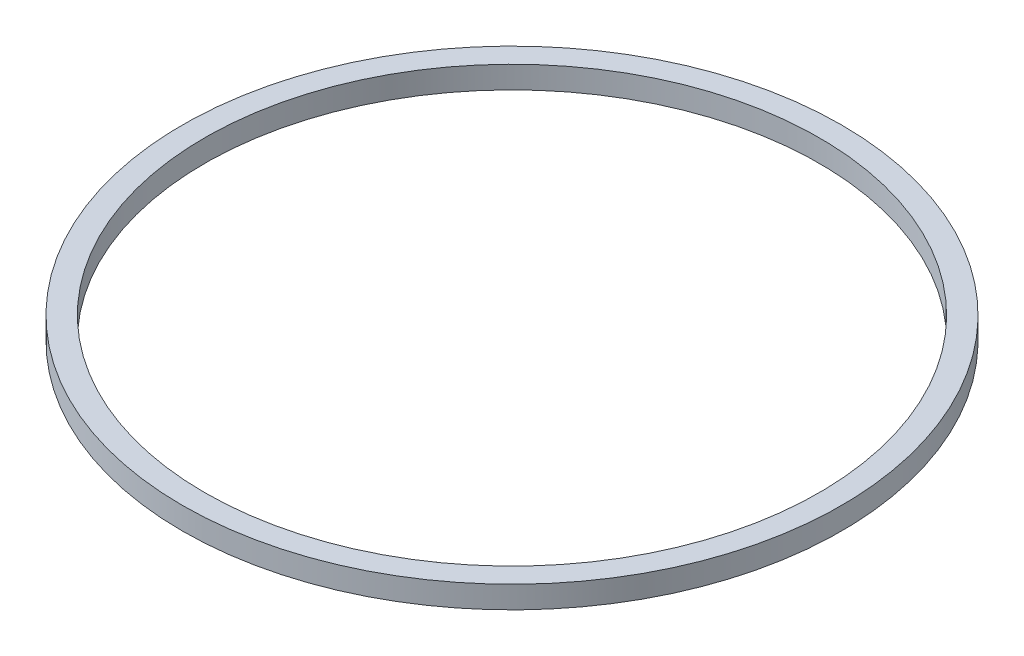
ISO-10303-21;
HEADER;
FILE_DESCRIPTION(('STEP AP214'),'2;1');
FILE_NAME('part.step','',(''),(''),'','','');
FILE_SCHEMA(('AUTOMOTIVE_DESIGN { 1 0 10303 214 1 1 1 1 }'));
ENDSEC;
DATA;
#1=APPLICATION_CONTEXT('core data for automotive mechanical design processes');
#2=APPLICATION_PROTOCOL_DEFINITION('international standard','automotive_design',2000,#1);
#3=PRODUCT_CONTEXT('',#1,'mechanical');
#4=PRODUCT('Part','Part','',(#3));
#5=PRODUCT_RELATED_PRODUCT_CATEGORY('part','',(#4));
#6=PRODUCT_DEFINITION_FORMATION('','',#4);
#7=PRODUCT_DEFINITION_CONTEXT('part definition',#1,'design');
#8=PRODUCT_DEFINITION('design','',#6,#7);
#9=PRODUCT_DEFINITION_SHAPE('','',#8);
#10=(LENGTH_UNIT() NAMED_UNIT(*) SI_UNIT(.MILLI.,.METRE.));
#11=(NAMED_UNIT(*) PLANE_ANGLE_UNIT() SI_UNIT($,.RADIAN.));
#12=(NAMED_UNIT(*) SI_UNIT($,.STERADIAN.) SOLID_ANGLE_UNIT());
#13=UNCERTAINTY_MEASURE_WITH_UNIT(LENGTH_MEASURE(1.E-05),#10,'distance_accuracy_value','');
#14=(GEOMETRIC_REPRESENTATION_CONTEXT(3) GLOBAL_UNCERTAINTY_ASSIGNED_CONTEXT((#13)) GLOBAL_UNIT_ASSIGNED_CONTEXT((#10,
#11,#12)) REPRESENTATION_CONTEXT('',''));
#15=CARTESIAN_POINT('',(0.,0.,0.));
#16=DIRECTION('',(0.,0.,1.));
#17=DIRECTION('',(1.,0.,0.));
#18=AXIS2_PLACEMENT_3D('',#15,#16,#17);
#19=CARTESIAN_POINT('',(0.,3.,0.));
#20=DIRECTION('',(0.,1.,0.));
#21=DIRECTION('',(0.,0.,1.));
#22=AXIS2_PLACEMENT_3D('',#19,#20,#21);
#23=PLANE('',#22);
#24=CARTESIAN_POINT('',(0.,3.,0.));
#25=DIRECTION('',(0.,1.,0.));
#26=DIRECTION('',(0.,0.,1.));
#27=AXIS2_PLACEMENT_3D('',#24,#25,#26);
#28=CIRCLE('',#27,44.5);
#29=CARTESIAN_POINT('',(0.,3.,44.5));
#30=VERTEX_POINT('',#29);
#31=EDGE_CURVE('E10',#30,#30,#28,.T.);
#32=ORIENTED_EDGE('',*,*,#31,.T.);
#33=EDGE_LOOP('',(#32));
#34=FACE_BOUND('',#33,.T.);
#35=CARTESIAN_POINT('',(0.,3.,0.));
#36=DIRECTION('',(0.,1.,0.));
#37=DIRECTION('',(0.,0.,1.));
#38=AXIS2_PLACEMENT_3D('',#35,#36,#37);
#39=CIRCLE('',#38,41.5);
#40=CARTESIAN_POINT('',(0.,3.,41.5));
#41=VERTEX_POINT('',#40);
#42=EDGE_CURVE('E50',#41,#41,#39,.T.);
#43=ORIENTED_EDGE('',*,*,#42,.F.);
#44=EDGE_LOOP('',(#43));
#45=FACE_BOUND('',#44,.T.);
#46=ADVANCED_FACE('F37',(#34,#45),#23,.T.);
#47=CARTESIAN_POINT('',(0.,0.,0.));
#48=DIRECTION('',(0.,1.,0.));
#49=DIRECTION('',(0.,0.,1.));
#50=AXIS2_PLACEMENT_3D('',#47,#48,#49);
#51=PLANE('',#50);
#52=CARTESIAN_POINT('',(0.,0.,0.));
#53=DIRECTION('',(0.,1.,0.));
#54=DIRECTION('',(0.,0.,1.));
#55=AXIS2_PLACEMENT_3D('',#52,#53,#54);
#56=CIRCLE('',#55,44.5);
#57=CARTESIAN_POINT('',(0.,0.,44.5));
#58=VERTEX_POINT('',#57);
#59=EDGE_CURVE('E41',#58,#58,#56,.T.);
#60=ORIENTED_EDGE('',*,*,#59,.F.);
#61=EDGE_LOOP('',(#60));
#62=FACE_BOUND('',#61,.T.);
#63=CARTESIAN_POINT('',(0.,0.,0.));
#64=DIRECTION('',(0.,1.,0.));
#65=DIRECTION('',(0.,0.,1.));
#66=AXIS2_PLACEMENT_3D('',#63,#64,#65);
#67=CIRCLE('',#66,41.5);
#68=CARTESIAN_POINT('',(0.,0.,41.5));
#69=VERTEX_POINT('',#68);
#70=EDGE_CURVE('E52',#69,#69,#67,.T.);
#71=ORIENTED_EDGE('',*,*,#70,.T.);
#72=EDGE_LOOP('',(#71));
#73=FACE_BOUND('',#72,.T.);
#74=ADVANCED_FACE('F64',(#62,#73),#51,.F.);
#75=CARTESIAN_POINT('',(0.,3.,0.));
#76=DIRECTION('',(0.,-1.,0.));
#77=DIRECTION('',(0.,0.,-1.));
#78=AXIS2_PLACEMENT_3D('',#75,#76,#77);
#79=CYLINDRICAL_SURFACE('',#78,44.5);
#80=ORIENTED_EDGE('',*,*,#31,.F.);
#81=EDGE_LOOP('',(#80));
#82=FACE_BOUND('',#81,.T.);
#83=ORIENTED_EDGE('',*,*,#59,.T.);
#84=EDGE_LOOP('',(#83));
#85=FACE_BOUND('',#84,.T.);
#86=ADVANCED_FACE('F39',(#82,#85),#79,.T.);
#87=CARTESIAN_POINT('',(0.,3.,0.));
#88=DIRECTION('',(0.,-1.,0.));
#89=DIRECTION('',(0.,0.,-1.));
#90=AXIS2_PLACEMENT_3D('',#87,#88,#89);
#91=CYLINDRICAL_SURFACE('',#90,41.5);
#92=ORIENTED_EDGE('',*,*,#42,.T.);
#93=EDGE_LOOP('',(#92));
#94=FACE_BOUND('',#93,.T.);
#95=ORIENTED_EDGE('',*,*,#70,.F.);
#96=EDGE_LOOP('',(#95));
#97=FACE_BOUND('',#96,.T.);
#98=ADVANCED_FACE('F60',(#94,#97),#91,.F.);
#99=CLOSED_SHELL('',(#46,#74,#86,#98));
#100=MANIFOLD_SOLID_BREP('B2',#99);
#101=ADVANCED_BREP_SHAPE_REPRESENTATION('',(#18,#100),#14);
#102=SHAPE_DEFINITION_REPRESENTATION(#9,#101);
ENDSEC;
END-ISO-10303-21;
